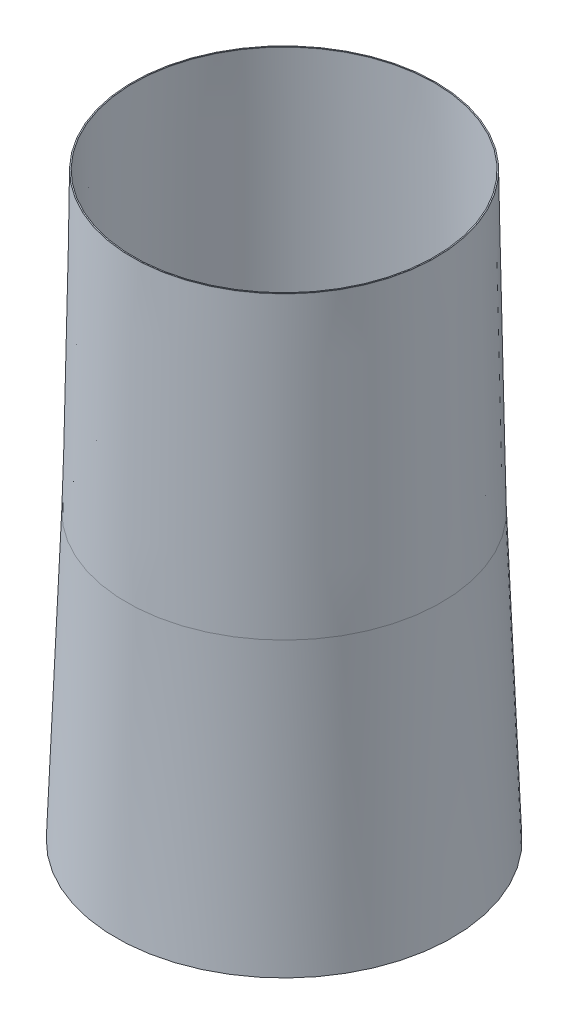
ISO-10303-21;
HEADER;
FILE_DESCRIPTION(('STEP AP214'),'2;1');
FILE_NAME('part.step','',(''),(''),'','','');
FILE_SCHEMA(('AUTOMOTIVE_DESIGN { 1 0 10303 214 1 1 1 1 }'));
ENDSEC;
DATA;
#1=APPLICATION_CONTEXT('core data for automotive mechanical design processes');
#2=APPLICATION_PROTOCOL_DEFINITION('international standard','automotive_design',2000,#1);
#3=PRODUCT_CONTEXT('',#1,'mechanical');
#4=PRODUCT('Part','Part','',(#3));
#5=PRODUCT_RELATED_PRODUCT_CATEGORY('part','',(#4));
#6=PRODUCT_DEFINITION_FORMATION('','',#4);
#7=PRODUCT_DEFINITION_CONTEXT('part definition',#1,'design');
#8=PRODUCT_DEFINITION('design','',#6,#7);
#9=PRODUCT_DEFINITION_SHAPE('','',#8);
#10=(LENGTH_UNIT() NAMED_UNIT(*) SI_UNIT(.MILLI.,.METRE.));
#11=(NAMED_UNIT(*) PLANE_ANGLE_UNIT() SI_UNIT($,.RADIAN.));
#12=(NAMED_UNIT(*) SI_UNIT($,.STERADIAN.) SOLID_ANGLE_UNIT());
#13=UNCERTAINTY_MEASURE_WITH_UNIT(LENGTH_MEASURE(1.E-05),#10,'distance_accuracy_value','');
#14=(GEOMETRIC_REPRESENTATION_CONTEXT(3) GLOBAL_UNCERTAINTY_ASSIGNED_CONTEXT((#13)) GLOBAL_UNIT_ASSIGNED_CONTEXT((#10,
#11,#12)) REPRESENTATION_CONTEXT('',''));
#15=CARTESIAN_POINT('',(0.,0.,0.));
#16=DIRECTION('',(0.,0.,1.));
#17=DIRECTION('',(1.,0.,0.));
#18=AXIS2_PLACEMENT_3D('',#15,#16,#17);
#19=CARTESIAN_POINT('',(0.,256.089285714286,0.));
#20=DIRECTION('',(0.,-1.,0.));
#21=DIRECTION('',(0.,0.,-1.));
#22=AXIS2_PLACEMENT_3D('',#19,#20,#21);
#23=TOROIDAL_SURFACE('',#22,667.07142857143,652.833356806899);
#24=CARTESIAN_POINT('',(0.,218.005833564072,0.));
#25=DIRECTION('',(0.,-1.,0.));
#26=DIRECTION('',(0.,0.,-1.));
#27=AXIS2_PLACEMENT_3D('',#24,#25,#26);
#28=CIRCLE('',#27,15.3498297026452);
#29=CARTESIAN_POINT('',(0.,218.005833564072,-15.3498297026452));
#30=VERTEX_POINT('',#29);
#31=EDGE_CURVE('E10',#30,#30,#28,.T.);
#32=ORIENTED_EDGE('',*,*,#31,.F.);
#33=EDGE_LOOP('',(#32));
#34=FACE_BOUND('',#33,.T.);
#35=CARTESIAN_POINT('',(0.,244.0018515344,0.));
#36=DIRECTION('',(0.,-1.,0.));
#37=DIRECTION('',(0.,0.,-1.));
#38=AXIS2_PLACEMENT_3D('',#35,#36,#37);
#39=CIRCLE('',#38,14.3499828576324);
#40=CARTESIAN_POINT('',(0.,244.0018515344,-14.3499828576324));
#41=VERTEX_POINT('',#40);
#42=EDGE_CURVE('E58',#41,#41,#39,.T.);
#43=ORIENTED_EDGE('',*,*,#42,.T.);
#44=EDGE_LOOP('',(#43));
#45=FACE_BOUND('',#44,.T.);
#46=ADVANCED_FACE('F30',(#34,#45),#23,.F.);
#47=CARTESIAN_POINT('',(0.,218.005833564072,0.));
#48=DIRECTION('',(0.,1.,0.));
#49=DIRECTION('',(0.,0.,1.));
#50=AXIS2_PLACEMENT_3D('',#47,#48,#49);
#51=CONICAL_SURFACE('',#50,15.3498297026452,1.5124275488201);
#52=CARTESIAN_POINT('',(0.,218.,0.));
#53=DIRECTION('',(0.,-1.,0.));
#54=DIRECTION('',(0.,0.,-1.));
#55=AXIS2_PLACEMENT_3D('',#52,#53,#54);
#56=CIRCLE('',#55,15.25);
#57=CARTESIAN_POINT('',(0.,218.,-15.25));
#58=VERTEX_POINT('',#57);
#59=EDGE_CURVE('E36',#58,#58,#56,.T.);
#60=ORIENTED_EDGE('',*,*,#59,.F.);
#61=EDGE_LOOP('',(#60));
#62=FACE_BOUND('',#61,.T.);
#63=ORIENTED_EDGE('',*,*,#31,.T.);
#64=EDGE_LOOP('',(#63));
#65=FACE_BOUND('',#64,.T.);
#66=ADVANCED_FACE('F95',(#62,#65),#51,.T.);
#67=CARTESIAN_POINT('',(0.,256.089285714286,0.));
#68=DIRECTION('',(0.,-1.,0.));
#69=DIRECTION('',(0.,0.,-1.));
#70=AXIS2_PLACEMENT_3D('',#67,#68,#69);
#71=TOROIDAL_SURFACE('',#70,667.07142857143,652.933356806899);
#72=CARTESIAN_POINT('',(0.,244.,0.));
#73=DIRECTION('',(0.,-1.,0.));
#74=DIRECTION('',(0.,0.,-1.));
#75=AXIS2_PLACEMENT_3D('',#72,#73,#74);
#76=CIRCLE('',#75,14.25);
#77=CARTESIAN_POINT('',(0.,244.,-14.25));
#78=VERTEX_POINT('',#77);
#79=EDGE_CURVE('E40',#78,#78,#76,.T.);
#80=ORIENTED_EDGE('',*,*,#79,.F.);
#81=EDGE_LOOP('',(#80));
#82=FACE_BOUND('',#81,.T.);
#83=ORIENTED_EDGE('',*,*,#59,.T.);
#84=EDGE_LOOP('',(#83));
#85=FACE_BOUND('',#84,.T.);
#86=ADVANCED_FACE('F90',(#82,#85),#71,.T.);
#87=CARTESIAN_POINT('',(0.,244.,0.));
#88=DIRECTION('',(0.,-1.,0.));
#89=DIRECTION('',(0.,0.,-1.));
#90=AXIS2_PLACEMENT_3D('',#87,#88,#89);
#91=CONICAL_SURFACE('',#90,14.25,0.0185164020680084);
#92=CARTESIAN_POINT('',(0.,271.,0.));
#93=DIRECTION('',(0.,-1.,0.));
#94=DIRECTION('',(0.,0.,-1.));
#95=AXIS2_PLACEMENT_3D('',#92,#93,#94);
#96=CIRCLE('',#95,13.75);
#97=CARTESIAN_POINT('',(0.,271.,-13.75));
#98=VERTEX_POINT('',#97);
#99=EDGE_CURVE('E44',#98,#98,#96,.T.);
#100=ORIENTED_EDGE('',*,*,#99,.F.);
#101=EDGE_LOOP('',(#100));
#102=FACE_BOUND('',#101,.T.);
#103=ORIENTED_EDGE('',*,*,#79,.T.);
#104=EDGE_LOOP('',(#103));
#105=FACE_BOUND('',#104,.T.);
#106=ADVANCED_FACE('F84',(#102,#105),#91,.F.);
#107=CARTESIAN_POINT('',(0.,271.018515344006,0.));
#108=DIRECTION('',(0.,-1.,0.));
#109=DIRECTION('',(0.,0.,-1.));
#110=AXIS2_PLACEMENT_3D('',#107,#108,#109);
#111=TOROIDAL_SURFACE('',#110,14.7498285763251,1.);
#112=CARTESIAN_POINT('',(0.,271.037030688012,0.));
#113=DIRECTION('',(0.,-1.,0.));
#114=DIRECTION('',(0.,0.,-1.));
#115=AXIS2_PLACEMENT_3D('',#112,#113,#114);
#116=CIRCLE('',#115,13.75);
#117=CARTESIAN_POINT('',(0.,271.037030688012,-13.75));
#118=VERTEX_POINT('',#117);
#119=EDGE_CURVE('E49',#118,#118,#116,.T.);
#120=ORIENTED_EDGE('',*,*,#119,.F.);
#121=EDGE_LOOP('',(#120));
#122=FACE_BOUND('',#121,.T.);
#123=ORIENTED_EDGE('',*,*,#99,.T.);
#124=EDGE_LOOP('',(#123));
#125=FACE_BOUND('',#124,.T.);
#126=ADVANCED_FACE('F78',(#122,#125),#111,.T.);
#127=CARTESIAN_POINT('',(0.,271.037030688012,0.));
#128=DIRECTION('',(0.,-1.,0.));
#129=DIRECTION('',(0.,0.,-1.));
#130=AXIS2_PLACEMENT_3D('',#127,#128,#129);
#131=CONICAL_SURFACE('',#130,13.75,1.55227992472659);
#132=CARTESIAN_POINT('',(0.,271.035179153612,0.));
#133=DIRECTION('',(0.,-1.,0.));
#134=DIRECTION('',(0.,0.,-1.));
#135=AXIS2_PLACEMENT_3D('',#132,#133,#134);
#136=CIRCLE('',#135,13.8499828576325);
#137=CARTESIAN_POINT('',(0.,271.035179153612,-13.8499828576325));
#138=VERTEX_POINT('',#137);
#139=EDGE_CURVE('E52',#138,#138,#136,.T.);
#140=ORIENTED_EDGE('',*,*,#139,.F.);
#141=EDGE_LOOP('',(#140));
#142=FACE_BOUND('',#141,.T.);
#143=ORIENTED_EDGE('',*,*,#119,.T.);
#144=EDGE_LOOP('',(#143));
#145=FACE_BOUND('',#144,.T.);
#146=ADVANCED_FACE('F72',(#142,#145),#131,.T.);
#147=CARTESIAN_POINT('',(0.,271.018515344006,0.));
#148=DIRECTION('',(0.,-1.,0.));
#149=DIRECTION('',(0.,0.,-1.));
#150=AXIS2_PLACEMENT_3D('',#147,#148,#149);
#151=TOROIDAL_SURFACE('',#150,14.7498285763251,0.900000000000002);
#152=CARTESIAN_POINT('',(0.,271.001851534401,0.));
#153=DIRECTION('',(0.,-1.,0.));
#154=DIRECTION('',(0.,0.,-1.));
#155=AXIS2_PLACEMENT_3D('',#152,#153,#154);
#156=CIRCLE('',#155,13.8499828576325);
#157=CARTESIAN_POINT('',(0.,271.001851534401,-13.8499828576325));
#158=VERTEX_POINT('',#157);
#159=EDGE_CURVE('E55',#158,#158,#156,.T.);
#160=ORIENTED_EDGE('',*,*,#159,.F.);
#161=EDGE_LOOP('',(#160));
#162=FACE_BOUND('',#161,.T.);
#163=ORIENTED_EDGE('',*,*,#139,.T.);
#164=EDGE_LOOP('',(#163));
#165=FACE_BOUND('',#164,.T.);
#166=ADVANCED_FACE('F66',(#162,#165),#151,.F.);
#167=CARTESIAN_POINT('',(0.,271.001851534401,0.));
#168=DIRECTION('',(0.,-1.,0.));
#169=DIRECTION('',(0.,0.,-1.));
#170=AXIS2_PLACEMENT_3D('',#167,#168,#169);
#171=CONICAL_SURFACE('',#170,13.8499828576325,0.0185164020680066);
#172=ORIENTED_EDGE('',*,*,#42,.F.);
#173=EDGE_LOOP('',(#172));
#174=FACE_BOUND('',#173,.T.);
#175=ORIENTED_EDGE('',*,*,#159,.T.);
#176=EDGE_LOOP('',(#175));
#177=FACE_BOUND('',#176,.T.);
#178=ADVANCED_FACE('F63',(#174,#177),#171,.T.);
#179=CLOSED_SHELL('',(#46,#66,#86,#106,#126,#146,#166,#178));
#180=MANIFOLD_SOLID_BREP('B2',#179);
#181=ADVANCED_BREP_SHAPE_REPRESENTATION('',(#18,#180),#14);
#182=SHAPE_DEFINITION_REPRESENTATION(#9,#181);
ENDSEC;
END-ISO-10303-21;
